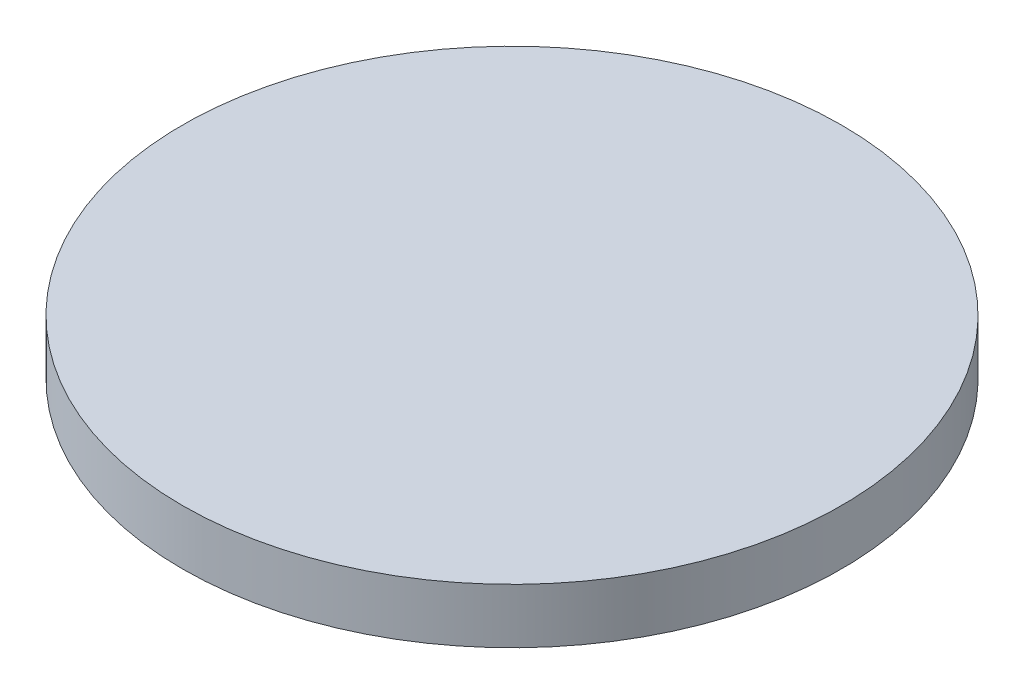
ISO-10303-21;
HEADER;
FILE_DESCRIPTION(('STEP AP214'),'2;1');
FILE_NAME('part.step','',(''),(''),'','','');
FILE_SCHEMA(('AUTOMOTIVE_DESIGN { 1 0 10303 214 1 1 1 1 }'));
ENDSEC;
DATA;
#1=APPLICATION_CONTEXT('core data for automotive mechanical design processes');
#2=APPLICATION_PROTOCOL_DEFINITION('international standard','automotive_design',2000,#1);
#3=PRODUCT_CONTEXT('',#1,'mechanical');
#4=PRODUCT('Part','Part','',(#3));
#5=PRODUCT_RELATED_PRODUCT_CATEGORY('part','',(#4));
#6=PRODUCT_DEFINITION_FORMATION('','',#4);
#7=PRODUCT_DEFINITION_CONTEXT('part definition',#1,'design');
#8=PRODUCT_DEFINITION('design','',#6,#7);
#9=PRODUCT_DEFINITION_SHAPE('','',#8);
#10=(LENGTH_UNIT() NAMED_UNIT(*) SI_UNIT(.MILLI.,.METRE.));
#11=(NAMED_UNIT(*) PLANE_ANGLE_UNIT() SI_UNIT($,.RADIAN.));
#12=(NAMED_UNIT(*) SI_UNIT($,.STERADIAN.) SOLID_ANGLE_UNIT());
#13=UNCERTAINTY_MEASURE_WITH_UNIT(LENGTH_MEASURE(1.E-05),#10,'distance_accuracy_value','');
#14=(GEOMETRIC_REPRESENTATION_CONTEXT(3) GLOBAL_UNCERTAINTY_ASSIGNED_CONTEXT((#13)) GLOBAL_UNIT_ASSIGNED_CONTEXT((#10,
#11,#12)) REPRESENTATION_CONTEXT('',''));
#15=CARTESIAN_POINT('',(0.,0.,0.));
#16=DIRECTION('',(0.,0.,1.));
#17=DIRECTION('',(1.,0.,0.));
#18=AXIS2_PLACEMENT_3D('',#15,#16,#17);
#19=CARTESIAN_POINT('',(0.,2.5,0.));
#20=DIRECTION('',(0.,-1.,0.));
#21=DIRECTION('',(0.,0.,-1.));
#22=AXIS2_PLACEMENT_3D('',#19,#20,#21);
#23=CYLINDRICAL_SURFACE('',#22,30.);
#24=CARTESIAN_POINT('',(0.,2.5,0.));
#25=DIRECTION('',(0.,1.,0.));
#26=DIRECTION('',(0.,0.,1.));
#27=AXIS2_PLACEMENT_3D('',#24,#25,#26);
#28=CIRCLE('',#27,30.);
#29=CARTESIAN_POINT('',(0.,2.5,30.));
#30=VERTEX_POINT('',#29);
#31=EDGE_CURVE('E10',#30,#30,#28,.T.);
#32=ORIENTED_EDGE('',*,*,#31,.F.);
#33=EDGE_LOOP('',(#32));
#34=FACE_BOUND('',#33,.T.);
#35=CARTESIAN_POINT('',(0.,-2.5,0.));
#36=DIRECTION('',(0.,1.,0.));
#37=DIRECTION('',(0.,0.,1.));
#38=AXIS2_PLACEMENT_3D('',#35,#36,#37);
#39=CIRCLE('',#38,30.);
#40=CARTESIAN_POINT('',(0.,-2.5,30.));
#41=VERTEX_POINT('',#40);
#42=EDGE_CURVE('E38',#41,#41,#39,.T.);
#43=ORIENTED_EDGE('',*,*,#42,.T.);
#44=EDGE_LOOP('',(#43));
#45=FACE_BOUND('',#44,.T.);
#46=ADVANCED_FACE('F35',(#34,#45),#23,.T.);
#47=CARTESIAN_POINT('',(0.,2.5,0.));
#48=DIRECTION('',(0.,1.,0.));
#49=DIRECTION('',(0.,0.,1.));
#50=AXIS2_PLACEMENT_3D('',#47,#48,#49);
#51=PLANE('',#50);
#52=ORIENTED_EDGE('',*,*,#31,.T.);
#53=EDGE_LOOP('',(#52));
#54=FACE_BOUND('',#53,.T.);
#55=ADVANCED_FACE('F50',(#54),#51,.T.);
#56=CARTESIAN_POINT('',(0.,-2.5,0.));
#57=DIRECTION('',(0.,1.,0.));
#58=DIRECTION('',(0.,0.,1.));
#59=AXIS2_PLACEMENT_3D('',#56,#57,#58);
#60=PLANE('',#59);
#61=ORIENTED_EDGE('',*,*,#42,.F.);
#62=EDGE_LOOP('',(#61));
#63=FACE_BOUND('',#62,.T.);
#64=ADVANCED_FACE('F48',(#63),#60,.F.);
#65=CLOSED_SHELL('',(#46,#55,#64));
#66=MANIFOLD_SOLID_BREP('B2',#65);
#67=ADVANCED_BREP_SHAPE_REPRESENTATION('',(#18,#66),#14);
#68=SHAPE_DEFINITION_REPRESENTATION(#9,#67);
ENDSEC;
END-ISO-10303-21;
